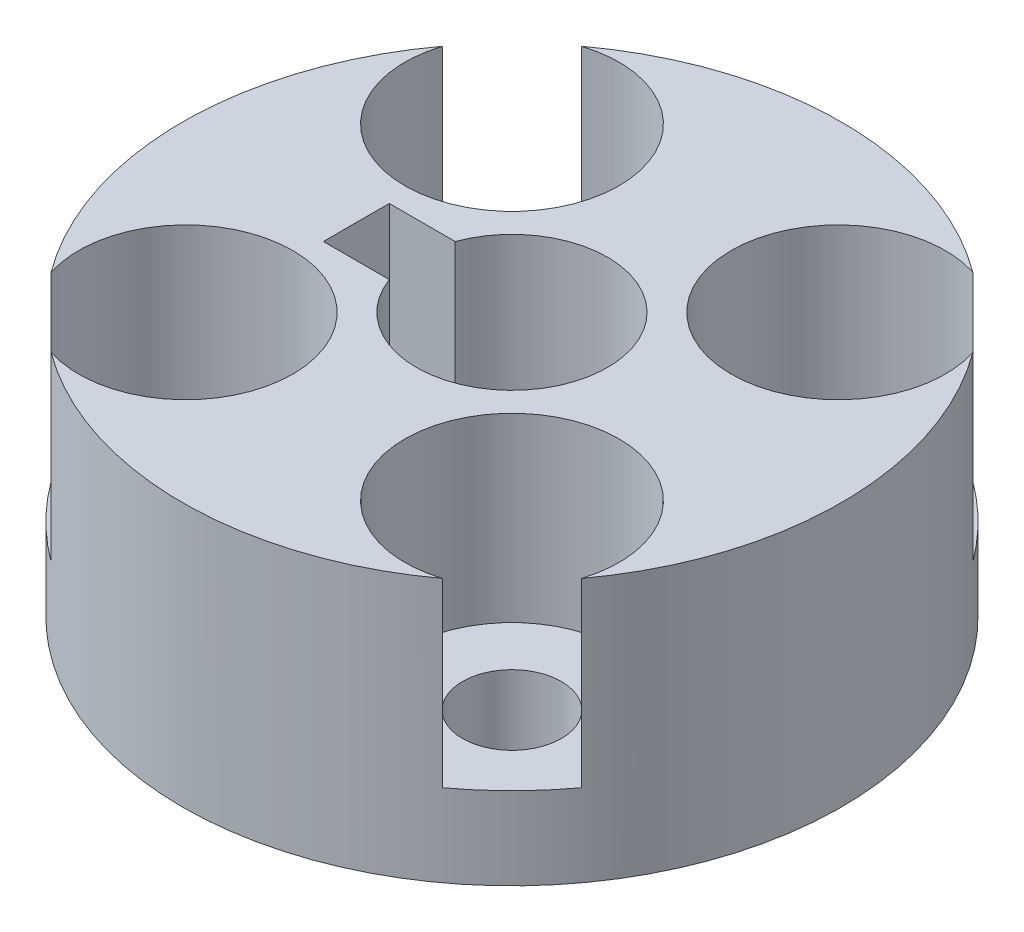
ISO-10303-21;
HEADER;
FILE_DESCRIPTION(('STEP AP214'),'2;1');
FILE_NAME('part.step','',(''),(''),'','','');
FILE_SCHEMA(('AUTOMOTIVE_DESIGN { 1 0 10303 214 1 1 1 1 }'));
ENDSEC;
DATA;
#1=APPLICATION_CONTEXT('core data for automotive mechanical design processes');
#2=APPLICATION_PROTOCOL_DEFINITION('international standard','automotive_design',2000,#1);
#3=PRODUCT_CONTEXT('',#1,'mechanical');
#4=PRODUCT('Part','Part','',(#3));
#5=PRODUCT_RELATED_PRODUCT_CATEGORY('part','',(#4));
#6=PRODUCT_DEFINITION_FORMATION('','',#4);
#7=PRODUCT_DEFINITION_CONTEXT('part definition',#1,'design');
#8=PRODUCT_DEFINITION('design','',#6,#7);
#9=PRODUCT_DEFINITION_SHAPE('','',#8);
#10=(LENGTH_UNIT() NAMED_UNIT(*) SI_UNIT(.MILLI.,.METRE.));
#11=(NAMED_UNIT(*) PLANE_ANGLE_UNIT() SI_UNIT($,.RADIAN.));
#12=(NAMED_UNIT(*) SI_UNIT($,.STERADIAN.) SOLID_ANGLE_UNIT());
#13=UNCERTAINTY_MEASURE_WITH_UNIT(LENGTH_MEASURE(1.E-05),#10,'distance_accuracy_value','');
#14=(GEOMETRIC_REPRESENTATION_CONTEXT(3) GLOBAL_UNCERTAINTY_ASSIGNED_CONTEXT((#13)) GLOBAL_UNIT_ASSIGNED_CONTEXT((#10,
#11,#12)) REPRESENTATION_CONTEXT('',''));
#15=CARTESIAN_POINT('',(0.,0.,0.));
#16=DIRECTION('',(0.,0.,1.));
#17=DIRECTION('',(1.,0.,0.));
#18=AXIS2_PLACEMENT_3D('',#15,#16,#17);
#19=CARTESIAN_POINT('',(0.,2.5,0.));
#20=DIRECTION('',(0.,1.,0.));
#21=DIRECTION('',(0.,0.,1.));
#22=AXIS2_PLACEMENT_3D('',#19,#20,#21);
#23=PLANE('',#22);
#24=CARTESIAN_POINT('',(4.94974746830583,2.5,4.94974746830583));
#25=DIRECTION('',(0.,1.,0.));
#26=DIRECTION('',(0.,0.,1.));
#27=AXIS2_PLACEMENT_3D('',#24,#25,#26);
#28=CIRCLE('',#27,3.25);
#29=CARTESIAN_POINT('',(5.93865861379429,2.5,8.04564067485038));
#30=VERTEX_POINT('',#29);
#31=CARTESIAN_POINT('',(8.04564067485039,2.5,5.93865861379428));
#32=VERTEX_POINT('',#31);
#33=EDGE_CURVE('E222',#30,#32,#28,.F.);
#34=ORIENTED_EDGE('',*,*,#33,.F.);
#35=CARTESIAN_POINT('',(0.,2.5,0.));
#36=DIRECTION('',(0.,1.,0.));
#37=DIRECTION('',(0.,0.,1.));
#38=AXIS2_PLACEMENT_3D('',#35,#36,#37);
#39=CIRCLE('',#38,10.);
#40=EDGE_CURVE('E226',#30,#32,#39,.T.);
#41=ORIENTED_EDGE('',*,*,#40,.T.);
#42=EDGE_LOOP('',(#34,#41));
#43=FACE_BOUND('',#42,.T.);
#44=CARTESIAN_POINT('',(4.94974746830583,2.5,4.94974746830583));
#45=DIRECTION('',(0.,1.,0.));
#46=DIRECTION('',(0.,0.,1.));
#47=AXIS2_PLACEMENT_3D('',#44,#45,#46);
#48=CIRCLE('',#47,1.5);
#49=CARTESIAN_POINT('',(4.94974746830583,2.5,6.44974746830583));
#50=VERTEX_POINT('',#49);
#51=EDGE_CURVE('E242',#50,#50,#48,.T.);
#52=ORIENTED_EDGE('',*,*,#51,.F.);
#53=EDGE_LOOP('',(#52));
#54=FACE_BOUND('',#53,.T.);
#55=ADVANCED_FACE('F43',(#43,#54),#23,.T.);
#56=CARTESIAN_POINT('',(4.94974746830583,2.5,-4.94974746830583));
#57=DIRECTION('',(0.,1.,0.));
#58=DIRECTION('',(0.,0.,1.));
#59=AXIS2_PLACEMENT_3D('',#56,#57,#58);
#60=CIRCLE('',#59,3.25);
#61=CARTESIAN_POINT('',(8.04564067485039,2.5,-5.93865861379428));
#62=VERTEX_POINT('',#61);
#63=CARTESIAN_POINT('',(5.93865861379428,2.5,-8.04564067485038));
#64=VERTEX_POINT('',#63);
#65=EDGE_CURVE('E218',#62,#64,#60,.F.);
#66=ORIENTED_EDGE('',*,*,#65,.F.);
#67=EDGE_CURVE('E230',#62,#64,#39,.T.);
#68=ORIENTED_EDGE('',*,*,#67,.T.);
#69=EDGE_LOOP('',(#66,#68));
#70=FACE_BOUND('',#69,.T.);
#71=CARTESIAN_POINT('',(4.94974746830583,2.5,-4.94974746830583));
#72=DIRECTION('',(0.,1.,0.));
#73=DIRECTION('',(0.,0.,1.));
#74=AXIS2_PLACEMENT_3D('',#71,#72,#73);
#75=CIRCLE('',#74,1.5);
#76=CARTESIAN_POINT('',(4.94974746830583,2.5,-3.44974746830583));
#77=VERTEX_POINT('',#76);
#78=EDGE_CURVE('E238',#77,#77,#75,.T.);
#79=ORIENTED_EDGE('',*,*,#78,.F.);
#80=EDGE_LOOP('',(#79));
#81=FACE_BOUND('',#80,.T.);
#82=ADVANCED_FACE('F310',(#70,#81),#23,.T.);
#83=CARTESIAN_POINT('',(-4.94974746830583,2.5,-4.94974746830583));
#84=DIRECTION('',(0.,1.,0.));
#85=DIRECTION('',(0.,0.,1.));
#86=AXIS2_PLACEMENT_3D('',#83,#84,#85);
#87=CIRCLE('',#86,3.25);
#88=CARTESIAN_POINT('',(-5.93865861379429,2.5,-8.04564067485038));
#89=VERTEX_POINT('',#88);
#90=CARTESIAN_POINT('',(-8.04564067485038,2.5,-5.93865861379429));
#91=VERTEX_POINT('',#90);
#92=EDGE_CURVE('E214',#89,#91,#87,.F.);
#93=ORIENTED_EDGE('',*,*,#92,.F.);
#94=EDGE_CURVE('E453',#89,#91,#39,.T.);
#95=ORIENTED_EDGE('',*,*,#94,.T.);
#96=EDGE_LOOP('',(#93,#95));
#97=FACE_BOUND('',#96,.T.);
#98=CARTESIAN_POINT('',(-4.94974746830583,2.5,-4.94974746830583));
#99=DIRECTION('',(0.,1.,0.));
#100=DIRECTION('',(0.,0.,1.));
#101=AXIS2_PLACEMENT_3D('',#98,#99,#100);
#102=CIRCLE('',#101,1.5);
#103=CARTESIAN_POINT('',(-4.94974746830583,2.5,-3.44974746830583));
#104=VERTEX_POINT('',#103);
#105=EDGE_CURVE('E234',#104,#104,#102,.T.);
#106=ORIENTED_EDGE('',*,*,#105,.F.);
#107=EDGE_LOOP('',(#106));
#108=FACE_BOUND('',#107,.T.);
#109=ADVANCED_FACE('F316',(#97,#108),#23,.T.);
#110=CARTESIAN_POINT('',(0.,2.5,0.));
#111=DIRECTION('',(0.,-1.,0.));
#112=DIRECTION('',(0.,0.,-1.));
#113=AXIS2_PLACEMENT_3D('',#110,#111,#112);
#114=CYLINDRICAL_SURFACE('',#113,2.9);
#115=CARTESIAN_POINT('',(0.,0.,0.));
#116=DIRECTION('',(0.,1.,0.));
#117=DIRECTION('',(0.,0.,1.));
#118=AXIS2_PLACEMENT_3D('',#115,#116,#117);
#119=CIRCLE('',#118,2.9);
#120=CARTESIAN_POINT('',(-2.72213151776324,0.,1.));
#121=VERTEX_POINT('',#120);
#122=CARTESIAN_POINT('',(-2.72213151776324,0.,-1.));
#123=VERTEX_POINT('',#122);
#124=EDGE_CURVE('E133',#121,#123,#119,.T.);
#125=ORIENTED_EDGE('',*,*,#124,.F.);
#126=DIRECTION('',(0.,-1.,0.));
#127=VECTOR('',#126,1.);
#128=CARTESIAN_POINT('',(-2.72213151776324,2.5,1.));
#129=LINE('',#128,#127);
#130=CARTESIAN_POINT('',(-2.72213151776324,8.,1.));
#131=VERTEX_POINT('',#130);
#132=EDGE_CURVE('E11',#131,#121,#129,.T.);
#133=ORIENTED_EDGE('',*,*,#132,.F.);
#134=CARTESIAN_POINT('',(0.,8.,0.));
#135=DIRECTION('',(0.,1.,0.));
#136=DIRECTION('',(0.,0.,1.));
#137=AXIS2_PLACEMENT_3D('',#134,#135,#136);
#138=CIRCLE('',#137,2.9);
#139=CARTESIAN_POINT('',(-2.72213151776324,8.,-1.));
#140=VERTEX_POINT('',#139);
#141=EDGE_CURVE('E130',#131,#140,#138,.T.);
#142=ORIENTED_EDGE('',*,*,#141,.T.);
#143=DIRECTION('',(0.,-1.,0.));
#144=VECTOR('',#143,1.);
#145=CARTESIAN_POINT('',(-2.72213151776324,2.5,-1.));
#146=LINE('',#145,#144);
#147=EDGE_CURVE('E246',#140,#123,#146,.T.);
#148=ORIENTED_EDGE('',*,*,#147,.T.);
#149=EDGE_LOOP('',(#125,#133,#142,#148));
#150=FACE_BOUND('',#149,.T.);
#151=ADVANCED_FACE('F45',(#150),#114,.F.);
#152=CARTESIAN_POINT('',(0.,2.5,1.));
#153=DIRECTION('',(0.,0.,-1.));
#154=DIRECTION('',(-1.,0.,0.));
#155=AXIS2_PLACEMENT_3D('',#152,#153,#154);
#156=PLANE('',#155);
#157=DIRECTION('',(1.,0.,0.));
#158=VECTOR('',#157,1.);
#159=CARTESIAN_POINT('',(0.,0.,1.));
#160=LINE('',#159,#158);
#161=CARTESIAN_POINT('',(-4.72213151776324,0.,1.));
#162=VERTEX_POINT('',#161);
#163=EDGE_CURVE('E249',#162,#121,#160,.T.);
#164=ORIENTED_EDGE('',*,*,#163,.F.);
#165=DIRECTION('',(0.,-1.,0.));
#166=VECTOR('',#165,1.);
#167=CARTESIAN_POINT('',(-4.72213151776324,2.5,1.));
#168=LINE('',#167,#166);
#169=CARTESIAN_POINT('',(-4.72213151776324,8.,1.));
#170=VERTEX_POINT('',#169);
#171=EDGE_CURVE('E52',#170,#162,#168,.T.);
#172=ORIENTED_EDGE('',*,*,#171,.F.);
#173=DIRECTION('',(1.,0.,0.));
#174=VECTOR('',#173,1.);
#175=CARTESIAN_POINT('',(0.,8.,1.));
#176=LINE('',#175,#174);
#177=EDGE_CURVE('E143',#170,#131,#176,.T.);
#178=ORIENTED_EDGE('',*,*,#177,.T.);
#179=ORIENTED_EDGE('',*,*,#132,.T.);
#180=EDGE_LOOP('',(#164,#172,#178,#179));
#181=FACE_BOUND('',#180,.T.);
#182=ADVANCED_FACE('F149',(#181),#156,.T.);
#183=CARTESIAN_POINT('',(-4.72213151776324,2.5,0.));
#184=DIRECTION('',(1.,0.,0.));
#185=DIRECTION('',(0.,0.,-1.));
#186=AXIS2_PLACEMENT_3D('',#183,#184,#185);
#187=PLANE('',#186);
#188=DIRECTION('',(0.,0.,1.));
#189=VECTOR('',#188,1.);
#190=CARTESIAN_POINT('',(-4.72213151776324,0.,0.));
#191=LINE('',#190,#189);
#192=CARTESIAN_POINT('',(-4.72213151776324,0.,-1.));
#193=VERTEX_POINT('',#192);
#194=EDGE_CURVE('E252',#193,#162,#191,.T.);
#195=ORIENTED_EDGE('',*,*,#194,.F.);
#196=DIRECTION('',(0.,-1.,0.));
#197=VECTOR('',#196,1.);
#198=CARTESIAN_POINT('',(-4.72213151776324,2.5,-1.));
#199=LINE('',#198,#197);
#200=CARTESIAN_POINT('',(-4.72213151776324,8.,-1.));
#201=VERTEX_POINT('',#200);
#202=EDGE_CURVE('E282',#201,#193,#199,.T.);
#203=ORIENTED_EDGE('',*,*,#202,.F.);
#204=DIRECTION('',(0.,0.,1.));
#205=VECTOR('',#204,1.);
#206=CARTESIAN_POINT('',(-4.72213151776324,8.,0.));
#207=LINE('',#206,#205);
#208=EDGE_CURVE('E151',#201,#170,#207,.T.);
#209=ORIENTED_EDGE('',*,*,#208,.T.);
#210=ORIENTED_EDGE('',*,*,#171,.T.);
#211=EDGE_LOOP('',(#195,#203,#209,#210));
#212=FACE_BOUND('',#211,.T.);
#213=ADVANCED_FACE('F287',(#212),#187,.T.);
#214=CARTESIAN_POINT('',(4.94974746830583,2.5,-4.94974746830583));
#215=DIRECTION('',(0.,-1.,0.));
#216=DIRECTION('',(0.,0.,-1.));
#217=AXIS2_PLACEMENT_3D('',#214,#215,#216);
#218=CYLINDRICAL_SURFACE('',#217,1.5);
#219=ORIENTED_EDGE('',*,*,#78,.T.);
#220=EDGE_LOOP('',(#219));
#221=FACE_BOUND('',#220,.T.);
#222=CARTESIAN_POINT('',(4.94974746830583,0.,-4.94974746830583));
#223=DIRECTION('',(0.,1.,0.));
#224=DIRECTION('',(0.,0.,1.));
#225=AXIS2_PLACEMENT_3D('',#222,#223,#224);
#226=CIRCLE('',#225,1.5);
#227=CARTESIAN_POINT('',(4.94974746830583,0.,-3.44974746830583));
#228=VERTEX_POINT('',#227);
#229=EDGE_CURVE('E272',#228,#228,#226,.T.);
#230=ORIENTED_EDGE('',*,*,#229,.F.);
#231=EDGE_LOOP('',(#230));
#232=FACE_BOUND('',#231,.T.);
#233=ADVANCED_FACE('F341',(#221,#232),#218,.F.);
#234=CARTESIAN_POINT('',(-4.94974746830583,2.5,-4.94974746830583));
#235=DIRECTION('',(0.,-1.,0.));
#236=DIRECTION('',(0.,0.,-1.));
#237=AXIS2_PLACEMENT_3D('',#234,#235,#236);
#238=CYLINDRICAL_SURFACE('',#237,1.5);
#239=ORIENTED_EDGE('',*,*,#105,.T.);
#240=EDGE_LOOP('',(#239));
#241=FACE_BOUND('',#240,.T.);
#242=CARTESIAN_POINT('',(-4.94974746830583,0.,-4.94974746830583));
#243=DIRECTION('',(0.,1.,0.));
#244=DIRECTION('',(0.,0.,1.));
#245=AXIS2_PLACEMENT_3D('',#242,#243,#244);
#246=CIRCLE('',#245,1.5);
#247=CARTESIAN_POINT('',(-4.94974746830583,0.,-3.44974746830583));
#248=VERTEX_POINT('',#247);
#249=EDGE_CURVE('E268',#248,#248,#246,.T.);
#250=ORIENTED_EDGE('',*,*,#249,.F.);
#251=EDGE_LOOP('',(#250));
#252=FACE_BOUND('',#251,.T.);
#253=ADVANCED_FACE('F338',(#241,#252),#238,.F.);
#254=CARTESIAN_POINT('',(-4.94974746830583,2.5,4.94974746830583));
#255=DIRECTION('',(0.,-1.,0.));
#256=DIRECTION('',(0.,0.,-1.));
#257=AXIS2_PLACEMENT_3D('',#254,#255,#256);
#258=CYLINDRICAL_SURFACE('',#257,1.5);
#259=CARTESIAN_POINT('',(-4.94974746830583,2.5,4.94974746830583));
#260=DIRECTION('',(0.,1.,0.));
#261=DIRECTION('',(0.,0.,1.));
#262=AXIS2_PLACEMENT_3D('',#259,#260,#261);
#263=CIRCLE('',#262,1.5);
#264=CARTESIAN_POINT('',(-4.94974746830583,2.5,6.44974746830583));
#265=VERTEX_POINT('',#264);
#266=EDGE_CURVE('E229',#265,#265,#263,.T.);
#267=ORIENTED_EDGE('',*,*,#266,.T.);
#268=EDGE_LOOP('',(#267));
#269=FACE_BOUND('',#268,.T.);
#270=CARTESIAN_POINT('',(-4.94974746830583,0.,4.94974746830583));
#271=DIRECTION('',(0.,1.,0.));
#272=DIRECTION('',(0.,0.,1.));
#273=AXIS2_PLACEMENT_3D('',#270,#271,#272);
#274=CIRCLE('',#273,1.5);
#275=CARTESIAN_POINT('',(-4.94974746830583,0.,6.44974746830583));
#276=VERTEX_POINT('',#275);
#277=EDGE_CURVE('E264',#276,#276,#274,.T.);
#278=ORIENTED_EDGE('',*,*,#277,.F.);
#279=EDGE_LOOP('',(#278));
#280=FACE_BOUND('',#279,.T.);
#281=ADVANCED_FACE('F305',(#269,#280),#258,.F.);
#282=CARTESIAN_POINT('',(0.,2.5,0.));
#283=DIRECTION('',(0.,-1.,0.));
#284=DIRECTION('',(0.,0.,-1.));
#285=AXIS2_PLACEMENT_3D('',#282,#283,#284);
#286=CYLINDRICAL_SURFACE('',#285,10.);
#287=CARTESIAN_POINT('',(0.,0.,0.));
#288=DIRECTION('',(0.,1.,0.));
#289=DIRECTION('',(0.,0.,1.));
#290=AXIS2_PLACEMENT_3D('',#287,#288,#289);
#291=CIRCLE('',#290,10.);
#292=CARTESIAN_POINT('',(0.,0.,10.));
#293=VERTEX_POINT('',#292);
#294=EDGE_CURVE('E260',#293,#293,#291,.T.);
#295=ORIENTED_EDGE('',*,*,#294,.T.);
#296=EDGE_LOOP('',(#295));
#297=FACE_BOUND('',#296,.T.);
#298=CARTESIAN_POINT('',(-8.04564067485038,2.5,5.93865861379429));
#299=VERTEX_POINT('',#298);
#300=CARTESIAN_POINT('',(-5.93865861379429,2.5,8.04564067485038));
#301=VERTEX_POINT('',#300);
#302=EDGE_CURVE('E58',#299,#301,#39,.T.);
#303=ORIENTED_EDGE('',*,*,#302,.F.);
#304=DIRECTION('',(0.,-1.,0.));
#305=VECTOR('',#304,1.);
#306=CARTESIAN_POINT('',(-8.04564067485038,8.,5.93865861379429));
#307=LINE('',#306,#305);
#308=CARTESIAN_POINT('',(-8.04564067485038,8.,5.93865861379429));
#309=VERTEX_POINT('',#308);
#310=EDGE_CURVE('E188',#309,#299,#307,.T.);
#311=ORIENTED_EDGE('',*,*,#310,.F.);
#312=CARTESIAN_POINT('',(0.,8.,0.));
#313=DIRECTION('',(0.,1.,0.));
#314=DIRECTION('',(0.,0.,1.));
#315=AXIS2_PLACEMENT_3D('',#312,#313,#314);
#316=CIRCLE('',#315,10.);
#317=CARTESIAN_POINT('',(-8.04564067485038,8.,-5.93865861379429));
#318=VERTEX_POINT('',#317);
#319=EDGE_CURVE('E175',#318,#309,#316,.T.);
#320=ORIENTED_EDGE('',*,*,#319,.F.);
#321=DIRECTION('',(0.,-1.,0.));
#322=VECTOR('',#321,1.);
#323=CARTESIAN_POINT('',(-8.04564067485038,8.,-5.93865861379429));
#324=LINE('',#323,#322);
#325=EDGE_CURVE('E192',#318,#91,#324,.T.);
#326=ORIENTED_EDGE('',*,*,#325,.T.);
#327=ORIENTED_EDGE('',*,*,#94,.F.);
#328=DIRECTION('',(0.,-1.,0.));
#329=VECTOR('',#328,1.);
#330=CARTESIAN_POINT('',(-5.93865861379429,8.,-8.04564067485038));
#331=LINE('',#330,#329);
#332=CARTESIAN_POINT('',(-5.93865861379429,8.,-8.04564067485038));
#333=VERTEX_POINT('',#332);
#334=EDGE_CURVE('E196',#333,#89,#331,.T.);
#335=ORIENTED_EDGE('',*,*,#334,.F.);
#336=CARTESIAN_POINT('',(5.93865861379428,8.,-8.04564067485038));
#337=VERTEX_POINT('',#336);
#338=EDGE_CURVE('E167',#337,#333,#316,.T.);
#339=ORIENTED_EDGE('',*,*,#338,.F.);
#340=DIRECTION('',(0.,-1.,0.));
#341=VECTOR('',#340,1.);
#342=CARTESIAN_POINT('',(5.93865861379428,8.,-8.04564067485038));
#343=LINE('',#342,#341);
#344=EDGE_CURVE('E200',#337,#64,#343,.T.);
#345=ORIENTED_EDGE('',*,*,#344,.T.);
#346=ORIENTED_EDGE('',*,*,#67,.F.);
#347=DIRECTION('',(0.,-1.,0.));
#348=VECTOR('',#347,1.);
#349=CARTESIAN_POINT('',(8.04564067485039,8.,-5.93865861379428));
#350=LINE('',#349,#348);
#351=CARTESIAN_POINT('',(8.04564067485039,8.,-5.93865861379428));
#352=VERTEX_POINT('',#351);
#353=EDGE_CURVE('E204',#352,#62,#350,.T.);
#354=ORIENTED_EDGE('',*,*,#353,.F.);
#355=CARTESIAN_POINT('',(8.04564067485039,8.,5.93865861379428));
#356=VERTEX_POINT('',#355);
#357=EDGE_CURVE('E162',#356,#352,#316,.T.);
#358=ORIENTED_EDGE('',*,*,#357,.F.);
#359=DIRECTION('',(0.,-1.,0.));
#360=VECTOR('',#359,1.);
#361=CARTESIAN_POINT('',(8.04564067485039,8.,5.93865861379428));
#362=LINE('',#361,#360);
#363=EDGE_CURVE('E208',#356,#32,#362,.T.);
#364=ORIENTED_EDGE('',*,*,#363,.T.);
#365=ORIENTED_EDGE('',*,*,#40,.F.);
#366=DIRECTION('',(0.,-1.,0.));
#367=VECTOR('',#366,1.);
#368=CARTESIAN_POINT('',(5.93865861379429,8.,8.04564067485038));
#369=LINE('',#368,#367);
#370=CARTESIAN_POINT('',(5.93865861379429,8.,8.04564067485038));
#371=VERTEX_POINT('',#370);
#372=EDGE_CURVE('E180',#371,#30,#369,.T.);
#373=ORIENTED_EDGE('',*,*,#372,.F.);
#374=CARTESIAN_POINT('',(-5.93865861379429,8.,8.04564067485038));
#375=VERTEX_POINT('',#374);
#376=EDGE_CURVE('E166',#375,#371,#316,.T.);
#377=ORIENTED_EDGE('',*,*,#376,.F.);
#378=DIRECTION('',(0.,-1.,0.));
#379=VECTOR('',#378,1.);
#380=CARTESIAN_POINT('',(-5.93865861379429,8.,8.04564067485038));
#381=LINE('',#380,#379);
#382=EDGE_CURVE('E184',#375,#301,#381,.T.);
#383=ORIENTED_EDGE('',*,*,#382,.T.);
#384=EDGE_LOOP('',(#303,#311,#320,#326,#327,#335,#339,#345,#346,#354,#358,#364,#365,#373,#377,#383));
#385=FACE_BOUND('',#384,.T.);
#386=ADVANCED_FACE('F296',(#297,#385),#286,.T.);
#387=CARTESIAN_POINT('',(0.,2.5,-1.));
#388=DIRECTION('',(0.,0.,1.));
#389=DIRECTION('',(1.,0.,0.));
#390=AXIS2_PLACEMENT_3D('',#387,#388,#389);
#391=PLANE('',#390);
#392=DIRECTION('',(-1.,0.,0.));
#393=VECTOR('',#392,1.);
#394=CARTESIAN_POINT('',(0.,0.,-1.));
#395=LINE('',#394,#393);
#396=EDGE_CURVE('E256',#123,#193,#395,.T.);
#397=ORIENTED_EDGE('',*,*,#396,.F.);
#398=ORIENTED_EDGE('',*,*,#147,.F.);
#399=DIRECTION('',(-1.,0.,0.));
#400=VECTOR('',#399,1.);
#401=CARTESIAN_POINT('',(0.,8.,-1.));
#402=LINE('',#401,#400);
#403=EDGE_CURVE('E146',#140,#201,#402,.T.);
#404=ORIENTED_EDGE('',*,*,#403,.T.);
#405=ORIENTED_EDGE('',*,*,#202,.T.);
#406=EDGE_LOOP('',(#397,#398,#404,#405));
#407=FACE_BOUND('',#406,.T.);
#408=ADVANCED_FACE('F293',(#407),#391,.T.);
#409=CARTESIAN_POINT('',(4.94974746830583,2.5,4.94974746830583));
#410=DIRECTION('',(0.,-1.,0.));
#411=DIRECTION('',(0.,0.,-1.));
#412=AXIS2_PLACEMENT_3D('',#409,#410,#411);
#413=CYLINDRICAL_SURFACE('',#412,1.5);
#414=ORIENTED_EDGE('',*,*,#51,.T.);
#415=EDGE_LOOP('',(#414));
#416=FACE_BOUND('',#415,.T.);
#417=CARTESIAN_POINT('',(4.94974746830583,0.,4.94974746830583));
#418=DIRECTION('',(0.,1.,0.));
#419=DIRECTION('',(0.,0.,1.));
#420=AXIS2_PLACEMENT_3D('',#417,#418,#419);
#421=CIRCLE('',#420,1.5);
#422=CARTESIAN_POINT('',(4.94974746830583,0.,6.44974746830583));
#423=VERTEX_POINT('',#422);
#424=EDGE_CURVE('E276',#423,#423,#421,.T.);
#425=ORIENTED_EDGE('',*,*,#424,.F.);
#426=EDGE_LOOP('',(#425));
#427=FACE_BOUND('',#426,.T.);
#428=ADVANCED_FACE('F295',(#416,#427),#413,.F.);
#429=CARTESIAN_POINT('',(-4.94974746830583,2.5,4.94974746830583));
#430=DIRECTION('',(0.,1.,0.));
#431=DIRECTION('',(0.,0.,1.));
#432=AXIS2_PLACEMENT_3D('',#429,#430,#431);
#433=CIRCLE('',#432,3.25);
#434=EDGE_CURVE('E61',#299,#301,#433,.F.);
#435=ORIENTED_EDGE('',*,*,#434,.F.);
#436=ORIENTED_EDGE('',*,*,#302,.T.);
#437=EDGE_LOOP('',(#435,#436));
#438=FACE_BOUND('',#437,.T.);
#439=ORIENTED_EDGE('',*,*,#266,.F.);
#440=EDGE_LOOP('',(#439));
#441=FACE_BOUND('',#440,.T.);
#442=ADVANCED_FACE('F302',(#438,#441),#23,.T.);
#443=CARTESIAN_POINT('',(0.,0.,0.));
#444=DIRECTION('',(0.,1.,0.));
#445=DIRECTION('',(0.,0.,1.));
#446=AXIS2_PLACEMENT_3D('',#443,#444,#445);
#447=PLANE('',#446);
#448=ORIENTED_EDGE('',*,*,#294,.F.);
#449=EDGE_LOOP('',(#448));
#450=FACE_BOUND('',#449,.T.);
#451=ORIENTED_EDGE('',*,*,#277,.T.);
#452=EDGE_LOOP('',(#451));
#453=FACE_BOUND('',#452,.T.);
#454=ORIENTED_EDGE('',*,*,#124,.T.);
#455=ORIENTED_EDGE('',*,*,#396,.T.);
#456=ORIENTED_EDGE('',*,*,#194,.T.);
#457=ORIENTED_EDGE('',*,*,#163,.T.);
#458=EDGE_LOOP('',(#454,#455,#456,#457));
#459=FACE_BOUND('',#458,.T.);
#460=ORIENTED_EDGE('',*,*,#249,.T.);
#461=EDGE_LOOP('',(#460));
#462=FACE_BOUND('',#461,.T.);
#463=ORIENTED_EDGE('',*,*,#229,.T.);
#464=EDGE_LOOP('',(#463));
#465=FACE_BOUND('',#464,.T.);
#466=ORIENTED_EDGE('',*,*,#424,.T.);
#467=EDGE_LOOP('',(#466));
#468=FACE_BOUND('',#467,.T.);
#469=ADVANCED_FACE('F289',(#450,#453,#459,#462,#465,#468),#447,.F.);
#470=CARTESIAN_POINT('',(4.94974746830583,8.,4.94974746830583));
#471=DIRECTION('',(0.,-1.,0.));
#472=DIRECTION('',(0.,0.,-1.));
#473=AXIS2_PLACEMENT_3D('',#470,#471,#472);
#474=CYLINDRICAL_SURFACE('',#473,3.25);
#475=ORIENTED_EDGE('',*,*,#372,.T.);
#476=ORIENTED_EDGE('',*,*,#33,.T.);
#477=ORIENTED_EDGE('',*,*,#363,.F.);
#478=CARTESIAN_POINT('',(4.94974746830583,8.,4.94974746830583));
#479=DIRECTION('',(0.,1.,0.));
#480=DIRECTION('',(0.,0.,1.));
#481=AXIS2_PLACEMENT_3D('',#478,#479,#480);
#482=CIRCLE('',#481,3.25);
#483=EDGE_CURVE('E158',#356,#371,#482,.T.);
#484=ORIENTED_EDGE('',*,*,#483,.T.);
#485=EDGE_LOOP('',(#475,#476,#477,#484));
#486=FACE_BOUND('',#485,.T.);
#487=ADVANCED_FACE('F326',(#486),#474,.F.);
#488=CARTESIAN_POINT('',(4.94974746830583,8.,-4.94974746830583));
#489=DIRECTION('',(0.,-1.,0.));
#490=DIRECTION('',(0.,0.,-1.));
#491=AXIS2_PLACEMENT_3D('',#488,#489,#490);
#492=CYLINDRICAL_SURFACE('',#491,3.25);
#493=ORIENTED_EDGE('',*,*,#353,.T.);
#494=ORIENTED_EDGE('',*,*,#65,.T.);
#495=ORIENTED_EDGE('',*,*,#344,.F.);
#496=CARTESIAN_POINT('',(4.94974746830583,8.,-4.94974746830583));
#497=DIRECTION('',(0.,1.,0.));
#498=DIRECTION('',(0.,0.,1.));
#499=AXIS2_PLACEMENT_3D('',#496,#497,#498);
#500=CIRCLE('',#499,3.25);
#501=EDGE_CURVE('E165',#337,#352,#500,.T.);
#502=ORIENTED_EDGE('',*,*,#501,.T.);
#503=EDGE_LOOP('',(#493,#494,#495,#502));
#504=FACE_BOUND('',#503,.T.);
#505=ADVANCED_FACE('F405',(#504),#492,.F.);
#506=CARTESIAN_POINT('',(-4.94974746830583,8.,-4.94974746830583));
#507=DIRECTION('',(0.,-1.,0.));
#508=DIRECTION('',(0.,0.,-1.));
#509=AXIS2_PLACEMENT_3D('',#506,#507,#508);
#510=CYLINDRICAL_SURFACE('',#509,3.25);
#511=ORIENTED_EDGE('',*,*,#334,.T.);
#512=ORIENTED_EDGE('',*,*,#92,.T.);
#513=ORIENTED_EDGE('',*,*,#325,.F.);
#514=CARTESIAN_POINT('',(-4.94974746830583,8.,-4.94974746830583));
#515=DIRECTION('',(0.,1.,0.));
#516=DIRECTION('',(0.,0.,1.));
#517=AXIS2_PLACEMENT_3D('',#514,#515,#516);
#518=CIRCLE('',#517,3.25);
#519=EDGE_CURVE('E171',#318,#333,#518,.T.);
#520=ORIENTED_EDGE('',*,*,#519,.T.);
#521=EDGE_LOOP('',(#511,#512,#513,#520));
#522=FACE_BOUND('',#521,.T.);
#523=ADVANCED_FACE('F414',(#522),#510,.F.);
#524=CARTESIAN_POINT('',(-4.94974746830583,8.,4.94974746830583));
#525=DIRECTION('',(0.,-1.,0.));
#526=DIRECTION('',(0.,0.,-1.));
#527=AXIS2_PLACEMENT_3D('',#524,#525,#526);
#528=CYLINDRICAL_SURFACE('',#527,3.25);
#529=ORIENTED_EDGE('',*,*,#310,.T.);
#530=ORIENTED_EDGE('',*,*,#434,.T.);
#531=ORIENTED_EDGE('',*,*,#382,.F.);
#532=CARTESIAN_POINT('',(-4.94974746830583,8.,4.94974746830583));
#533=DIRECTION('',(0.,1.,0.));
#534=DIRECTION('',(0.,0.,1.));
#535=AXIS2_PLACEMENT_3D('',#532,#533,#534);
#536=CIRCLE('',#535,3.25);
#537=EDGE_CURVE('E176',#375,#309,#536,.T.);
#538=ORIENTED_EDGE('',*,*,#537,.T.);
#539=EDGE_LOOP('',(#529,#530,#531,#538));
#540=FACE_BOUND('',#539,.T.);
#541=ADVANCED_FACE('F424',(#540),#528,.F.);
#542=CARTESIAN_POINT('',(0.,8.,0.));
#543=DIRECTION('',(0.,1.,0.));
#544=DIRECTION('',(0.,0.,1.));
#545=AXIS2_PLACEMENT_3D('',#542,#543,#544);
#546=PLANE('',#545);
#547=ORIENTED_EDGE('',*,*,#141,.F.);
#548=ORIENTED_EDGE('',*,*,#177,.F.);
#549=ORIENTED_EDGE('',*,*,#208,.F.);
#550=ORIENTED_EDGE('',*,*,#403,.F.);
#551=EDGE_LOOP('',(#547,#548,#549,#550));
#552=FACE_BOUND('',#551,.T.);
#553=ORIENTED_EDGE('',*,*,#483,.F.);
#554=ORIENTED_EDGE('',*,*,#357,.T.);
#555=ORIENTED_EDGE('',*,*,#501,.F.);
#556=ORIENTED_EDGE('',*,*,#338,.T.);
#557=ORIENTED_EDGE('',*,*,#519,.F.);
#558=ORIENTED_EDGE('',*,*,#319,.T.);
#559=ORIENTED_EDGE('',*,*,#537,.F.);
#560=ORIENTED_EDGE('',*,*,#376,.T.);
#561=EDGE_LOOP('',(#553,#554,#555,#556,#557,#558,#559,#560));
#562=FACE_BOUND('',#561,.T.);
#563=ADVANCED_FACE('F140',(#552,#562),#546,.T.);
#564=CLOSED_SHELL('',(#55,#82,#109,#151,#182,#213,#233,#253,#281,#386,#408,#428,#442,#469,#487,
#505,#523,#541,#563));
#565=MANIFOLD_SOLID_BREP('B2',#564);
#566=ADVANCED_BREP_SHAPE_REPRESENTATION('',(#18,#565),#14);
#567=SHAPE_DEFINITION_REPRESENTATION(#9,#566);
ENDSEC;
END-ISO-10303-21;
